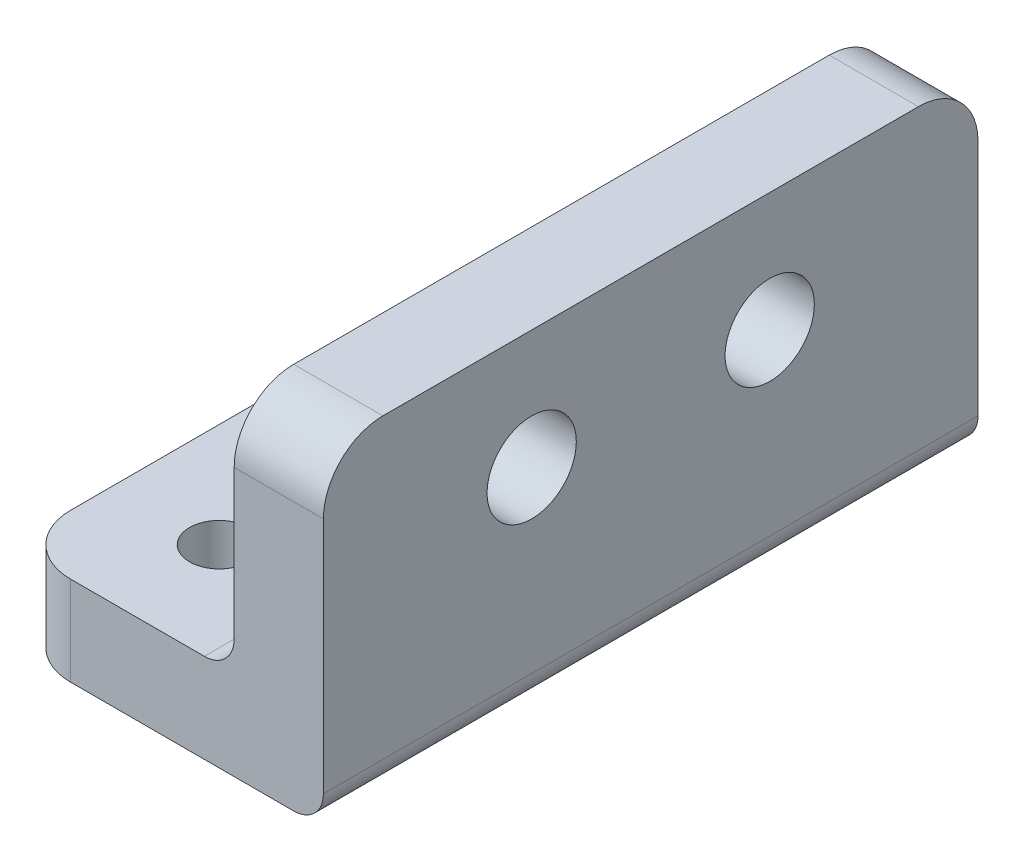
ISO-10303-21;
HEADER;
FILE_DESCRIPTION(('STEP AP214'),'2;1');
FILE_NAME('part.step','',(''),(''),'','','');
FILE_SCHEMA(('AUTOMOTIVE_DESIGN { 1 0 10303 214 1 1 1 1 }'));
ENDSEC;
DATA;
#1=APPLICATION_CONTEXT('core data for automotive mechanical design processes');
#2=APPLICATION_PROTOCOL_DEFINITION('international standard','automotive_design',2000,#1);
#3=PRODUCT_CONTEXT('',#1,'mechanical');
#4=PRODUCT('Part','Part','',(#3));
#5=PRODUCT_RELATED_PRODUCT_CATEGORY('part','',(#4));
#6=PRODUCT_DEFINITION_FORMATION('','',#4);
#7=PRODUCT_DEFINITION_CONTEXT('part definition',#1,'design');
#8=PRODUCT_DEFINITION('design','',#6,#7);
#9=PRODUCT_DEFINITION_SHAPE('','',#8);
#10=(LENGTH_UNIT() NAMED_UNIT(*) SI_UNIT(.MILLI.,.METRE.));
#11=(NAMED_UNIT(*) PLANE_ANGLE_UNIT() SI_UNIT($,.RADIAN.));
#12=(NAMED_UNIT(*) SI_UNIT($,.STERADIAN.) SOLID_ANGLE_UNIT());
#13=UNCERTAINTY_MEASURE_WITH_UNIT(LENGTH_MEASURE(1.E-05),#10,'distance_accuracy_value','');
#14=(GEOMETRIC_REPRESENTATION_CONTEXT(3) GLOBAL_UNCERTAINTY_ASSIGNED_CONTEXT((#13)) GLOBAL_UNIT_ASSIGNED_CONTEXT((#10,
#11,#12)) REPRESENTATION_CONTEXT('',''));
#15=CARTESIAN_POINT('',(0.,0.,0.));
#16=DIRECTION('',(0.,0.,1.));
#17=DIRECTION('',(1.,0.,0.));
#18=AXIS2_PLACEMENT_3D('',#15,#16,#17);
#19=CARTESIAN_POINT('',(0.,3.,11.));
#20=DIRECTION('',(0.,0.,-1.));
#21=DIRECTION('',(-1.,0.,0.));
#22=AXIS2_PLACEMENT_3D('',#19,#20,#21);
#23=PLANE('',#22);
#24=DIRECTION('',(1.,0.,0.));
#25=VECTOR('',#24,1.);
#26=CARTESIAN_POINT('',(0.,0.,11.));
#27=LINE('',#26,#25);
#28=CARTESIAN_POINT('',(-1.5,0.,11.));
#29=VERTEX_POINT('',#28);
#30=CARTESIAN_POINT('',(6.,0.,11.));
#31=VERTEX_POINT('',#30);
#32=EDGE_CURVE('E153',#29,#31,#27,.T.);
#33=ORIENTED_EDGE('',*,*,#32,.T.);
#34=CARTESIAN_POINT('',(6.,1.,11.));
#35=DIRECTION('',(0.,0.,-1.));
#36=DIRECTION('',(-1.,0.,0.));
#37=AXIS2_PLACEMENT_3D('',#34,#35,#36);
#38=CIRCLE('',#37,1.);
#39=CARTESIAN_POINT('',(7.,1.,11.));
#40=VERTEX_POINT('',#39);
#41=EDGE_CURVE('E72',#31,#40,#38,.F.);
#42=ORIENTED_EDGE('',*,*,#41,.T.);
#43=DIRECTION('',(0.,-1.,0.));
#44=VECTOR('',#43,1.);
#45=CARTESIAN_POINT('',(7.,3.,11.));
#46=LINE('',#45,#44);
#47=CARTESIAN_POINT('',(7.,9.,11.));
#48=VERTEX_POINT('',#47);
#49=EDGE_CURVE('E185',#48,#40,#46,.T.);
#50=ORIENTED_EDGE('',*,*,#49,.F.);
#51=DIRECTION('',(1.,0.,0.));
#52=VECTOR('',#51,1.);
#53=CARTESIAN_POINT('',(4.,9.,11.));
#54=LINE('',#53,#52);
#55=CARTESIAN_POINT('',(4.,9.,11.));
#56=VERTEX_POINT('',#55);
#57=EDGE_CURVE('E156',#48,#56,#54,.F.);
#58=ORIENTED_EDGE('',*,*,#57,.T.);
#59=DIRECTION('',(0.,-1.,0.));
#60=VECTOR('',#59,1.);
#61=CARTESIAN_POINT('',(4.,11.,11.));
#62=LINE('',#61,#60);
#63=CARTESIAN_POINT('',(4.,4.,11.));
#64=VERTEX_POINT('',#63);
#65=EDGE_CURVE('E170',#56,#64,#62,.T.);
#66=ORIENTED_EDGE('',*,*,#65,.T.);
#67=CARTESIAN_POINT('',(3.,4.,11.));
#68=DIRECTION('',(0.,0.,-1.));
#69=DIRECTION('',(-1.,0.,0.));
#70=AXIS2_PLACEMENT_3D('',#67,#68,#69);
#71=CIRCLE('',#70,1.);
#72=CARTESIAN_POINT('',(3.,3.,11.));
#73=VERTEX_POINT('',#72);
#74=EDGE_CURVE('E57',#64,#73,#71,.T.);
#75=ORIENTED_EDGE('',*,*,#74,.T.);
#76=DIRECTION('',(1.,0.,0.));
#77=VECTOR('',#76,1.);
#78=CARTESIAN_POINT('',(0.,3.,11.));
#79=LINE('',#78,#77);
#80=CARTESIAN_POINT('',(-1.5,3.,11.));
#81=VERTEX_POINT('',#80);
#82=EDGE_CURVE('E155',#81,#73,#79,.T.);
#83=ORIENTED_EDGE('',*,*,#82,.F.);
#84=DIRECTION('',(0.,-1.,0.));
#85=VECTOR('',#84,1.);
#86=CARTESIAN_POINT('',(-1.5,0.,11.));
#87=LINE('',#86,#85);
#88=EDGE_CURVE('E143',#81,#29,#87,.T.);
#89=ORIENTED_EDGE('',*,*,#88,.T.);
#90=EDGE_LOOP('',(#33,#42,#50,#58,#66,#75,#83,#89));
#91=FACE_BOUND('',#90,.T.);
#92=ADVANCED_FACE('F49',(#91),#23,.F.);
#93=CARTESIAN_POINT('',(7.,3.,0.));
#94=DIRECTION('',(1.,0.,0.));
#95=DIRECTION('',(0.,0.,-1.));
#96=AXIS2_PLACEMENT_3D('',#93,#94,#95);
#97=PLANE('',#96);
#98=CARTESIAN_POINT('',(7.,7.,4.));
#99=DIRECTION('',(1.,0.,0.));
#100=DIRECTION('',(0.,0.,-1.));
#101=AXIS2_PLACEMENT_3D('',#98,#99,#100);
#102=CIRCLE('',#101,1.5);
#103=CARTESIAN_POINT('',(7.,7.,2.5));
#104=VERTEX_POINT('',#103);
#105=EDGE_CURVE('E257',#104,#104,#102,.T.);
#106=ORIENTED_EDGE('',*,*,#105,.F.);
#107=EDGE_LOOP('',(#106));
#108=FACE_BOUND('',#107,.T.);
#109=CARTESIAN_POINT('',(7.,7.,-4.));
#110=DIRECTION('',(1.,0.,0.));
#111=DIRECTION('',(0.,0.,-1.));
#112=AXIS2_PLACEMENT_3D('',#109,#110,#111);
#113=CIRCLE('',#112,1.5);
#114=CARTESIAN_POINT('',(7.,7.,-5.5));
#115=VERTEX_POINT('',#114);
#116=EDGE_CURVE('E261',#115,#115,#113,.T.);
#117=ORIENTED_EDGE('',*,*,#116,.F.);
#118=EDGE_LOOP('',(#117));
#119=FACE_BOUND('',#118,.T.);
#120=ORIENTED_EDGE('',*,*,#49,.T.);
#121=DIRECTION('',(0.,0.,1.));
#122=VECTOR('',#121,1.);
#123=CARTESIAN_POINT('',(7.,1.,-11.));
#124=LINE('',#123,#122);
#125=CARTESIAN_POINT('',(7.,1.,-11.));
#126=VERTEX_POINT('',#125);
#127=EDGE_CURVE('E64',#40,#126,#124,.F.);
#128=ORIENTED_EDGE('',*,*,#127,.T.);
#129=DIRECTION('',(0.,-1.,0.));
#130=VECTOR('',#129,1.);
#131=CARTESIAN_POINT('',(7.,3.,-11.));
#132=LINE('',#131,#130);
#133=CARTESIAN_POINT('',(7.,9.,-11.));
#134=VERTEX_POINT('',#133);
#135=EDGE_CURVE('E183',#134,#126,#132,.T.);
#136=ORIENTED_EDGE('',*,*,#135,.F.);
#137=CARTESIAN_POINT('',(7.,9.,-9.));
#138=DIRECTION('',(1.,0.,0.));
#139=DIRECTION('',(0.,0.,-1.));
#140=AXIS2_PLACEMENT_3D('',#137,#138,#139);
#141=CIRCLE('',#140,2.);
#142=CARTESIAN_POINT('',(7.,11.,-9.00000000000001));
#143=VERTEX_POINT('',#142);
#144=EDGE_CURVE('E206',#134,#143,#141,.T.);
#145=ORIENTED_EDGE('',*,*,#144,.T.);
#146=DIRECTION('',(0.,0.,-1.));
#147=VECTOR('',#146,1.);
#148=CARTESIAN_POINT('',(7.,11.,11.));
#149=LINE('',#148,#147);
#150=CARTESIAN_POINT('',(7.,11.,9.));
#151=VERTEX_POINT('',#150);
#152=EDGE_CURVE('E256',#151,#143,#149,.T.);
#153=ORIENTED_EDGE('',*,*,#152,.F.);
#154=CARTESIAN_POINT('',(7.,9.,9.));
#155=DIRECTION('',(1.,0.,0.));
#156=DIRECTION('',(0.,0.,-1.));
#157=AXIS2_PLACEMENT_3D('',#154,#155,#156);
#158=CIRCLE('',#157,2.);
#159=EDGE_CURVE('E208',#151,#48,#158,.T.);
#160=ORIENTED_EDGE('',*,*,#159,.T.);
#161=EDGE_LOOP('',(#120,#128,#136,#145,#153,#160));
#162=FACE_BOUND('',#161,.T.);
#163=ADVANCED_FACE('F294',(#108,#119,#162),#97,.T.);
#164=CARTESIAN_POINT('',(0.,3.,-11.));
#165=DIRECTION('',(0.,0.,-1.));
#166=DIRECTION('',(-1.,0.,0.));
#167=AXIS2_PLACEMENT_3D('',#164,#165,#166);
#168=PLANE('',#167);
#169=ORIENTED_EDGE('',*,*,#135,.T.);
#170=CARTESIAN_POINT('',(6.,1.,-11.));
#171=DIRECTION('',(0.,0.,-1.));
#172=DIRECTION('',(-1.,0.,0.));
#173=AXIS2_PLACEMENT_3D('',#170,#171,#172);
#174=CIRCLE('',#173,1.);
#175=CARTESIAN_POINT('',(6.,0.,-11.));
#176=VERTEX_POINT('',#175);
#177=EDGE_CURVE('E222',#126,#176,#174,.T.);
#178=ORIENTED_EDGE('',*,*,#177,.T.);
#179=DIRECTION('',(1.,0.,0.));
#180=VECTOR('',#179,1.);
#181=CARTESIAN_POINT('',(0.,0.,-11.));
#182=LINE('',#181,#180);
#183=CARTESIAN_POINT('',(-1.5,0.,-11.));
#184=VERTEX_POINT('',#183);
#185=EDGE_CURVE('E164',#184,#176,#182,.T.);
#186=ORIENTED_EDGE('',*,*,#185,.F.);
#187=DIRECTION('',(0.,-1.,0.));
#188=VECTOR('',#187,1.);
#189=CARTESIAN_POINT('',(-1.5,3.,-11.));
#190=LINE('',#189,#188);
#191=CARTESIAN_POINT('',(-1.5,3.,-11.));
#192=VERTEX_POINT('',#191);
#193=EDGE_CURVE('E198',#184,#192,#190,.F.);
#194=ORIENTED_EDGE('',*,*,#193,.T.);
#195=DIRECTION('',(1.,0.,0.));
#196=VECTOR('',#195,1.);
#197=CARTESIAN_POINT('',(0.,3.,-11.));
#198=LINE('',#197,#196);
#199=CARTESIAN_POINT('',(3.,3.,-11.));
#200=VERTEX_POINT('',#199);
#201=EDGE_CURVE('E234',#192,#200,#198,.T.);
#202=ORIENTED_EDGE('',*,*,#201,.T.);
#203=CARTESIAN_POINT('',(3.,4.,-11.));
#204=DIRECTION('',(0.,0.,-1.));
#205=DIRECTION('',(-1.,0.,0.));
#206=AXIS2_PLACEMENT_3D('',#203,#204,#205);
#207=CIRCLE('',#206,1.);
#208=CARTESIAN_POINT('',(4.,4.,-11.));
#209=VERTEX_POINT('',#208);
#210=EDGE_CURVE('E11',#200,#209,#207,.F.);
#211=ORIENTED_EDGE('',*,*,#210,.T.);
#212=DIRECTION('',(0.,-1.,0.));
#213=VECTOR('',#212,1.);
#214=CARTESIAN_POINT('',(4.,11.,-11.));
#215=LINE('',#214,#213);
#216=CARTESIAN_POINT('',(4.,9.,-11.));
#217=VERTEX_POINT('',#216);
#218=EDGE_CURVE('E165',#217,#209,#215,.T.);
#219=ORIENTED_EDGE('',*,*,#218,.F.);
#220=DIRECTION('',(-1.,0.,0.));
#221=VECTOR('',#220,1.);
#222=CARTESIAN_POINT('',(0.,9.,-11.));
#223=LINE('',#222,#221);
#224=EDGE_CURVE('E196',#217,#134,#223,.F.);
#225=ORIENTED_EDGE('',*,*,#224,.T.);
#226=EDGE_LOOP('',(#169,#178,#186,#194,#202,#211,#219,#225));
#227=FACE_BOUND('',#226,.T.);
#228=ADVANCED_FACE('F240',(#227),#168,.T.);
#229=CARTESIAN_POINT('',(0.,3.,-7.5));
#230=DIRECTION('',(0.,-1.,0.));
#231=DIRECTION('',(0.,0.,-1.));
#232=AXIS2_PLACEMENT_3D('',#229,#230,#231);
#233=CYLINDRICAL_SURFACE('',#232,1.);
#234=CARTESIAN_POINT('',(0.,3.,-7.5));
#235=DIRECTION('',(0.,1.,0.));
#236=DIRECTION('',(0.,0.,1.));
#237=AXIS2_PLACEMENT_3D('',#234,#235,#236);
#238=CIRCLE('',#237,1.);
#239=CARTESIAN_POINT('',(0.,3.,-6.5));
#240=VERTEX_POINT('',#239);
#241=EDGE_CURVE('E269',#240,#240,#238,.T.);
#242=ORIENTED_EDGE('',*,*,#241,.T.);
#243=EDGE_LOOP('',(#242));
#244=FACE_BOUND('',#243,.T.);
#245=CARTESIAN_POINT('',(0.,0.,-7.5));
#246=DIRECTION('',(0.,1.,0.));
#247=DIRECTION('',(0.,0.,1.));
#248=AXIS2_PLACEMENT_3D('',#245,#246,#247);
#249=CIRCLE('',#248,1.);
#250=CARTESIAN_POINT('',(0.,0.,-6.5));
#251=VERTEX_POINT('',#250);
#252=EDGE_CURVE('E177',#251,#251,#249,.T.);
#253=ORIENTED_EDGE('',*,*,#252,.F.);
#254=EDGE_LOOP('',(#253));
#255=FACE_BOUND('',#254,.T.);
#256=ADVANCED_FACE('F329',(#244,#255),#233,.F.);
#257=CARTESIAN_POINT('',(-3.5,3.,0.));
#258=DIRECTION('',(-1.,0.,0.));
#259=DIRECTION('',(0.,0.,1.));
#260=AXIS2_PLACEMENT_3D('',#257,#258,#259);
#261=PLANE('',#260);
#262=DIRECTION('',(0.,0.,-1.));
#263=VECTOR('',#262,1.);
#264=CARTESIAN_POINT('',(-3.5,0.,0.));
#265=LINE('',#264,#263);
#266=CARTESIAN_POINT('',(-3.5,0.,9.));
#267=VERTEX_POINT('',#266);
#268=CARTESIAN_POINT('',(-3.5,0.,-9.));
#269=VERTEX_POINT('',#268);
#270=EDGE_CURVE('E167',#267,#269,#265,.T.);
#271=ORIENTED_EDGE('',*,*,#270,.F.);
#272=DIRECTION('',(0.,-1.,0.));
#273=VECTOR('',#272,1.);
#274=CARTESIAN_POINT('',(-3.5,3.,9.));
#275=LINE('',#274,#273);
#276=CARTESIAN_POINT('',(-3.5,3.,9.));
#277=VERTEX_POINT('',#276);
#278=EDGE_CURVE('E144',#267,#277,#275,.F.);
#279=ORIENTED_EDGE('',*,*,#278,.T.);
#280=DIRECTION('',(0.,0.,-1.));
#281=VECTOR('',#280,1.);
#282=CARTESIAN_POINT('',(-3.5,3.,0.));
#283=LINE('',#282,#281);
#284=CARTESIAN_POINT('',(-3.5,3.,-9.));
#285=VERTEX_POINT('',#284);
#286=EDGE_CURVE('E267',#277,#285,#283,.T.);
#287=ORIENTED_EDGE('',*,*,#286,.T.);
#288=DIRECTION('',(0.,-1.,0.));
#289=VECTOR('',#288,1.);
#290=CARTESIAN_POINT('',(-3.5,3.,-9.));
#291=LINE('',#290,#289);
#292=EDGE_CURVE('E149',#285,#269,#291,.T.);
#293=ORIENTED_EDGE('',*,*,#292,.T.);
#294=EDGE_LOOP('',(#271,#279,#287,#293));
#295=FACE_BOUND('',#294,.T.);
#296=ADVANCED_FACE('F280',(#295),#261,.T.);
#297=CARTESIAN_POINT('',(0.,3.,7.5));
#298=DIRECTION('',(0.,-1.,0.));
#299=DIRECTION('',(0.,0.,-1.));
#300=AXIS2_PLACEMENT_3D('',#297,#298,#299);
#301=CYLINDRICAL_SURFACE('',#300,1.);
#302=CARTESIAN_POINT('',(0.,3.,7.5));
#303=DIRECTION('',(0.,1.,0.));
#304=DIRECTION('',(0.,0.,1.));
#305=AXIS2_PLACEMENT_3D('',#302,#303,#304);
#306=CIRCLE('',#305,1.);
#307=CARTESIAN_POINT('',(0.,3.,8.5));
#308=VERTEX_POINT('',#307);
#309=EDGE_CURVE('E173',#308,#308,#306,.F.);
#310=ORIENTED_EDGE('',*,*,#309,.F.);
#311=EDGE_LOOP('',(#310));
#312=FACE_BOUND('',#311,.T.);
#313=CARTESIAN_POINT('',(0.,0.,7.5));
#314=DIRECTION('',(0.,1.,0.));
#315=DIRECTION('',(0.,0.,1.));
#316=AXIS2_PLACEMENT_3D('',#313,#314,#315);
#317=CIRCLE('',#316,1.);
#318=CARTESIAN_POINT('',(0.,0.,8.5));
#319=VERTEX_POINT('',#318);
#320=EDGE_CURVE('E180',#319,#319,#317,.F.);
#321=ORIENTED_EDGE('',*,*,#320,.T.);
#322=EDGE_LOOP('',(#321));
#323=FACE_BOUND('',#322,.T.);
#324=ADVANCED_FACE('F277',(#312,#323),#301,.F.);
#325=CARTESIAN_POINT('',(0.,3.,0.));
#326=DIRECTION('',(0.,1.,0.));
#327=DIRECTION('',(0.,0.,1.));
#328=AXIS2_PLACEMENT_3D('',#325,#326,#327);
#329=PLANE('',#328);
#330=ORIENTED_EDGE('',*,*,#82,.T.);
#331=DIRECTION('',(0.,0.,1.));
#332=VECTOR('',#331,1.);
#333=CARTESIAN_POINT('',(3.,3.,0.));
#334=LINE('',#333,#332);
#335=EDGE_CURVE('E217',#73,#200,#334,.F.);
#336=ORIENTED_EDGE('',*,*,#335,.T.);
#337=ORIENTED_EDGE('',*,*,#201,.F.);
#338=CARTESIAN_POINT('',(-1.5,3.,-9.));
#339=DIRECTION('',(0.,1.,0.));
#340=DIRECTION('',(0.,0.,1.));
#341=AXIS2_PLACEMENT_3D('',#338,#339,#340);
#342=CIRCLE('',#341,2.);
#343=EDGE_CURVE('E192',#192,#285,#342,.T.);
#344=ORIENTED_EDGE('',*,*,#343,.T.);
#345=ORIENTED_EDGE('',*,*,#286,.F.);
#346=CARTESIAN_POINT('',(-1.5,3.,9.));
#347=DIRECTION('',(0.,1.,0.));
#348=DIRECTION('',(0.,0.,1.));
#349=AXIS2_PLACEMENT_3D('',#346,#347,#348);
#350=CIRCLE('',#349,2.);
#351=EDGE_CURVE('E194',#277,#81,#350,.T.);
#352=ORIENTED_EDGE('',*,*,#351,.T.);
#353=EDGE_LOOP('',(#330,#336,#337,#344,#345,#352));
#354=FACE_BOUND('',#353,.T.);
#355=ORIENTED_EDGE('',*,*,#241,.F.);
#356=EDGE_LOOP('',(#355));
#357=FACE_BOUND('',#356,.T.);
#358=ORIENTED_EDGE('',*,*,#309,.T.);
#359=EDGE_LOOP('',(#358));
#360=FACE_BOUND('',#359,.T.);
#361=ADVANCED_FACE('F229',(#354,#357,#360),#329,.T.);
#362=CARTESIAN_POINT('',(0.,0.,0.));
#363=DIRECTION('',(0.,1.,0.));
#364=DIRECTION('',(0.,0.,1.));
#365=AXIS2_PLACEMENT_3D('',#362,#363,#364);
#366=PLANE('',#365);
#367=ORIENTED_EDGE('',*,*,#185,.T.);
#368=DIRECTION('',(0.,0.,1.));
#369=VECTOR('',#368,1.);
#370=CARTESIAN_POINT('',(6.,0.,11.));
#371=LINE('',#370,#369);
#372=EDGE_CURVE('E163',#176,#31,#371,.T.);
#373=ORIENTED_EDGE('',*,*,#372,.T.);
#374=ORIENTED_EDGE('',*,*,#32,.F.);
#375=CARTESIAN_POINT('',(-1.5,0.,9.));
#376=DIRECTION('',(0.,1.,0.));
#377=DIRECTION('',(0.,0.,1.));
#378=AXIS2_PLACEMENT_3D('',#375,#376,#377);
#379=CIRCLE('',#378,2.);
#380=EDGE_CURVE('E139',#29,#267,#379,.F.);
#381=ORIENTED_EDGE('',*,*,#380,.T.);
#382=ORIENTED_EDGE('',*,*,#270,.T.);
#383=CARTESIAN_POINT('',(-1.5,0.,-9.));
#384=DIRECTION('',(0.,1.,0.));
#385=DIRECTION('',(0.,0.,1.));
#386=AXIS2_PLACEMENT_3D('',#383,#384,#385);
#387=CIRCLE('',#386,2.);
#388=EDGE_CURVE('E150',#269,#184,#387,.F.);
#389=ORIENTED_EDGE('',*,*,#388,.T.);
#390=EDGE_LOOP('',(#367,#373,#374,#381,#382,#389));
#391=FACE_BOUND('',#390,.T.);
#392=ORIENTED_EDGE('',*,*,#252,.T.);
#393=EDGE_LOOP('',(#392));
#394=FACE_BOUND('',#393,.T.);
#395=ORIENTED_EDGE('',*,*,#320,.F.);
#396=EDGE_LOOP('',(#395));
#397=FACE_BOUND('',#396,.T.);
#398=ADVANCED_FACE('F160',(#391,#394,#397),#366,.F.);
#399=CARTESIAN_POINT('',(4.,11.,-11.));
#400=DIRECTION('',(1.,0.,0.));
#401=DIRECTION('',(0.,0.,-1.));
#402=AXIS2_PLACEMENT_3D('',#399,#400,#401);
#403=PLANE('',#402);
#404=CARTESIAN_POINT('',(4.,7.,4.));
#405=DIRECTION('',(-1.,0.,0.));
#406=DIRECTION('',(0.,0.,1.));
#407=AXIS2_PLACEMENT_3D('',#404,#405,#406);
#408=CIRCLE('',#407,1.5);
#409=CARTESIAN_POINT('',(4.,7.,5.5));
#410=VERTEX_POINT('',#409);
#411=EDGE_CURVE('E464',#410,#410,#408,.T.);
#412=ORIENTED_EDGE('',*,*,#411,.F.);
#413=EDGE_LOOP('',(#412));
#414=FACE_BOUND('',#413,.T.);
#415=CARTESIAN_POINT('',(4.,7.,-4.));
#416=DIRECTION('',(-1.,0.,0.));
#417=DIRECTION('',(0.,0.,-1.));
#418=AXIS2_PLACEMENT_3D('',#415,#416,#417);
#419=CIRCLE('',#418,1.5);
#420=CARTESIAN_POINT('',(4.,7.,-5.5));
#421=VERTEX_POINT('',#420);
#422=EDGE_CURVE('E465',#421,#421,#419,.T.);
#423=ORIENTED_EDGE('',*,*,#422,.F.);
#424=EDGE_LOOP('',(#423));
#425=FACE_BOUND('',#424,.T.);
#426=ORIENTED_EDGE('',*,*,#218,.T.);
#427=DIRECTION('',(0.,0.,1.));
#428=VECTOR('',#427,1.);
#429=CARTESIAN_POINT('',(4.,4.,-11.));
#430=LINE('',#429,#428);
#431=EDGE_CURVE('E214',#209,#64,#430,.T.);
#432=ORIENTED_EDGE('',*,*,#431,.T.);
#433=ORIENTED_EDGE('',*,*,#65,.F.);
#434=CARTESIAN_POINT('',(4.,9.,9.));
#435=DIRECTION('',(1.,0.,0.));
#436=DIRECTION('',(0.,0.,-1.));
#437=AXIS2_PLACEMENT_3D('',#434,#435,#436);
#438=CIRCLE('',#437,2.);
#439=CARTESIAN_POINT('',(4.,11.,9.));
#440=VERTEX_POINT('',#439);
#441=EDGE_CURVE('E212',#56,#440,#438,.F.);
#442=ORIENTED_EDGE('',*,*,#441,.T.);
#443=DIRECTION('',(0.,0.,1.));
#444=VECTOR('',#443,1.);
#445=CARTESIAN_POINT('',(4.,11.,-11.));
#446=LINE('',#445,#444);
#447=CARTESIAN_POINT('',(4.,11.,-9.));
#448=VERTEX_POINT('',#447);
#449=EDGE_CURVE('E246',#448,#440,#446,.T.);
#450=ORIENTED_EDGE('',*,*,#449,.F.);
#451=CARTESIAN_POINT('',(4.,9.,-9.));
#452=DIRECTION('',(1.,0.,0.));
#453=DIRECTION('',(0.,0.,-1.));
#454=AXIS2_PLACEMENT_3D('',#451,#452,#453);
#455=CIRCLE('',#454,2.);
#456=EDGE_CURVE('E210',#448,#217,#455,.F.);
#457=ORIENTED_EDGE('',*,*,#456,.T.);
#458=EDGE_LOOP('',(#426,#432,#433,#442,#450,#457));
#459=FACE_BOUND('',#458,.T.);
#460=ADVANCED_FACE('F243',(#414,#425,#459),#403,.F.);
#461=CARTESIAN_POINT('',(0.,11.,0.));
#462=DIRECTION('',(0.,1.,0.));
#463=DIRECTION('',(0.,0.,1.));
#464=AXIS2_PLACEMENT_3D('',#461,#462,#463);
#465=PLANE('',#464);
#466=ORIENTED_EDGE('',*,*,#449,.T.);
#467=DIRECTION('',(1.,0.,0.));
#468=VECTOR('',#467,1.);
#469=CARTESIAN_POINT('',(7.,11.,9.));
#470=LINE('',#469,#468);
#471=EDGE_CURVE('E203',#440,#151,#470,.T.);
#472=ORIENTED_EDGE('',*,*,#471,.T.);
#473=ORIENTED_EDGE('',*,*,#152,.T.);
#474=DIRECTION('',(-1.,0.,0.));
#475=VECTOR('',#474,1.);
#476=CARTESIAN_POINT('',(0.,11.,-9.));
#477=LINE('',#476,#475);
#478=EDGE_CURVE('E200',#143,#448,#477,.T.);
#479=ORIENTED_EDGE('',*,*,#478,.T.);
#480=EDGE_LOOP('',(#466,#472,#473,#479));
#481=FACE_BOUND('',#480,.T.);
#482=ADVANCED_FACE('F253',(#481),#465,.T.);
#483=CARTESIAN_POINT('',(12.,7.,-4.));
#484=DIRECTION('',(-1.,0.,0.));
#485=DIRECTION('',(0.,0.,1.));
#486=AXIS2_PLACEMENT_3D('',#483,#484,#485);
#487=CYLINDRICAL_SURFACE('',#486,1.5);
#488=ORIENTED_EDGE('',*,*,#116,.T.);
#489=EDGE_LOOP('',(#488));
#490=FACE_BOUND('',#489,.T.);
#491=ORIENTED_EDGE('',*,*,#422,.T.);
#492=EDGE_LOOP('',(#491));
#493=FACE_BOUND('',#492,.T.);
#494=ADVANCED_FACE('F400',(#490,#493),#487,.F.);
#495=CARTESIAN_POINT('',(12.,7.,4.));
#496=DIRECTION('',(-1.,0.,0.));
#497=DIRECTION('',(0.,0.,1.));
#498=AXIS2_PLACEMENT_3D('',#495,#496,#497);
#499=CYLINDRICAL_SURFACE('',#498,1.5);
#500=ORIENTED_EDGE('',*,*,#105,.T.);
#501=EDGE_LOOP('',(#500));
#502=FACE_BOUND('',#501,.T.);
#503=ORIENTED_EDGE('',*,*,#411,.T.);
#504=EDGE_LOOP('',(#503));
#505=FACE_BOUND('',#504,.T.);
#506=ADVANCED_FACE('F307',(#502,#505),#499,.F.);
#507=CARTESIAN_POINT('',(-1.5,3.,9.));
#508=DIRECTION('',(0.,1.,0.));
#509=DIRECTION('',(0.,0.,1.));
#510=AXIS2_PLACEMENT_3D('',#507,#508,#509);
#511=CYLINDRICAL_SURFACE('',#510,2.);
#512=ORIENTED_EDGE('',*,*,#351,.F.);
#513=ORIENTED_EDGE('',*,*,#278,.F.);
#514=ORIENTED_EDGE('',*,*,#380,.F.);
#515=ORIENTED_EDGE('',*,*,#88,.F.);
#516=EDGE_LOOP('',(#512,#513,#514,#515));
#517=FACE_BOUND('',#516,.T.);
#518=ADVANCED_FACE('F142',(#517),#511,.T.);
#519=CARTESIAN_POINT('',(-1.5,3.,-9.));
#520=DIRECTION('',(0.,-1.,0.));
#521=DIRECTION('',(0.,0.,-1.));
#522=AXIS2_PLACEMENT_3D('',#519,#520,#521);
#523=CYLINDRICAL_SURFACE('',#522,2.);
#524=ORIENTED_EDGE('',*,*,#343,.F.);
#525=ORIENTED_EDGE('',*,*,#193,.F.);
#526=ORIENTED_EDGE('',*,*,#388,.F.);
#527=ORIENTED_EDGE('',*,*,#292,.F.);
#528=EDGE_LOOP('',(#524,#525,#526,#527));
#529=FACE_BOUND('',#528,.T.);
#530=ADVANCED_FACE('F306',(#529),#523,.T.);
#531=CARTESIAN_POINT('',(0.,9.,9.));
#532=DIRECTION('',(-1.,0.,0.));
#533=DIRECTION('',(0.,0.,1.));
#534=AXIS2_PLACEMENT_3D('',#531,#532,#533);
#535=CYLINDRICAL_SURFACE('',#534,2.);
#536=ORIENTED_EDGE('',*,*,#441,.F.);
#537=ORIENTED_EDGE('',*,*,#57,.F.);
#538=ORIENTED_EDGE('',*,*,#159,.F.);
#539=ORIENTED_EDGE('',*,*,#471,.F.);
#540=EDGE_LOOP('',(#536,#537,#538,#539));
#541=FACE_BOUND('',#540,.T.);
#542=ADVANCED_FACE('F310',(#541),#535,.T.);
#543=CARTESIAN_POINT('',(0.,9.,-9.));
#544=DIRECTION('',(-1.,0.,0.));
#545=DIRECTION('',(0.,0.,1.));
#546=AXIS2_PLACEMENT_3D('',#543,#544,#545);
#547=CYLINDRICAL_SURFACE('',#546,2.);
#548=ORIENTED_EDGE('',*,*,#144,.F.);
#549=ORIENTED_EDGE('',*,*,#224,.F.);
#550=ORIENTED_EDGE('',*,*,#456,.F.);
#551=ORIENTED_EDGE('',*,*,#478,.F.);
#552=EDGE_LOOP('',(#548,#549,#550,#551));
#553=FACE_BOUND('',#552,.T.);
#554=ADVANCED_FACE('F250',(#553),#547,.T.);
#555=CARTESIAN_POINT('',(3.,4.,-11.));
#556=DIRECTION('',(0.,0.,1.));
#557=DIRECTION('',(1.,0.,0.));
#558=AXIS2_PLACEMENT_3D('',#555,#556,#557);
#559=CYLINDRICAL_SURFACE('',#558,1.);
#560=ORIENTED_EDGE('',*,*,#210,.F.);
#561=ORIENTED_EDGE('',*,*,#335,.F.);
#562=ORIENTED_EDGE('',*,*,#74,.F.);
#563=ORIENTED_EDGE('',*,*,#431,.F.);
#564=EDGE_LOOP('',(#560,#561,#562,#563));
#565=FACE_BOUND('',#564,.T.);
#566=ADVANCED_FACE('F237',(#565),#559,.F.);
#567=CARTESIAN_POINT('',(6.,1.,0.));
#568=DIRECTION('',(0.,0.,-1.));
#569=DIRECTION('',(-1.,0.,0.));
#570=AXIS2_PLACEMENT_3D('',#567,#568,#569);
#571=CYLINDRICAL_SURFACE('',#570,1.);
#572=ORIENTED_EDGE('',*,*,#177,.F.);
#573=ORIENTED_EDGE('',*,*,#127,.F.);
#574=ORIENTED_EDGE('',*,*,#41,.F.);
#575=ORIENTED_EDGE('',*,*,#372,.F.);
#576=EDGE_LOOP('',(#572,#573,#574,#575));
#577=FACE_BOUND('',#576,.T.);
#578=ADVANCED_FACE('F51',(#577),#571,.T.);
#579=CLOSED_SHELL('',(#92,#163,#228,#256,#296,#324,#361,#398,#460,#482,#494,#506,#518,#530,#542,
#554,#566,#578));
#580=MANIFOLD_SOLID_BREP('B2',#579);
#581=ADVANCED_BREP_SHAPE_REPRESENTATION('',(#18,#580),#14);
#582=SHAPE_DEFINITION_REPRESENTATION(#9,#581);
ENDSEC;
END-ISO-10303-21;
